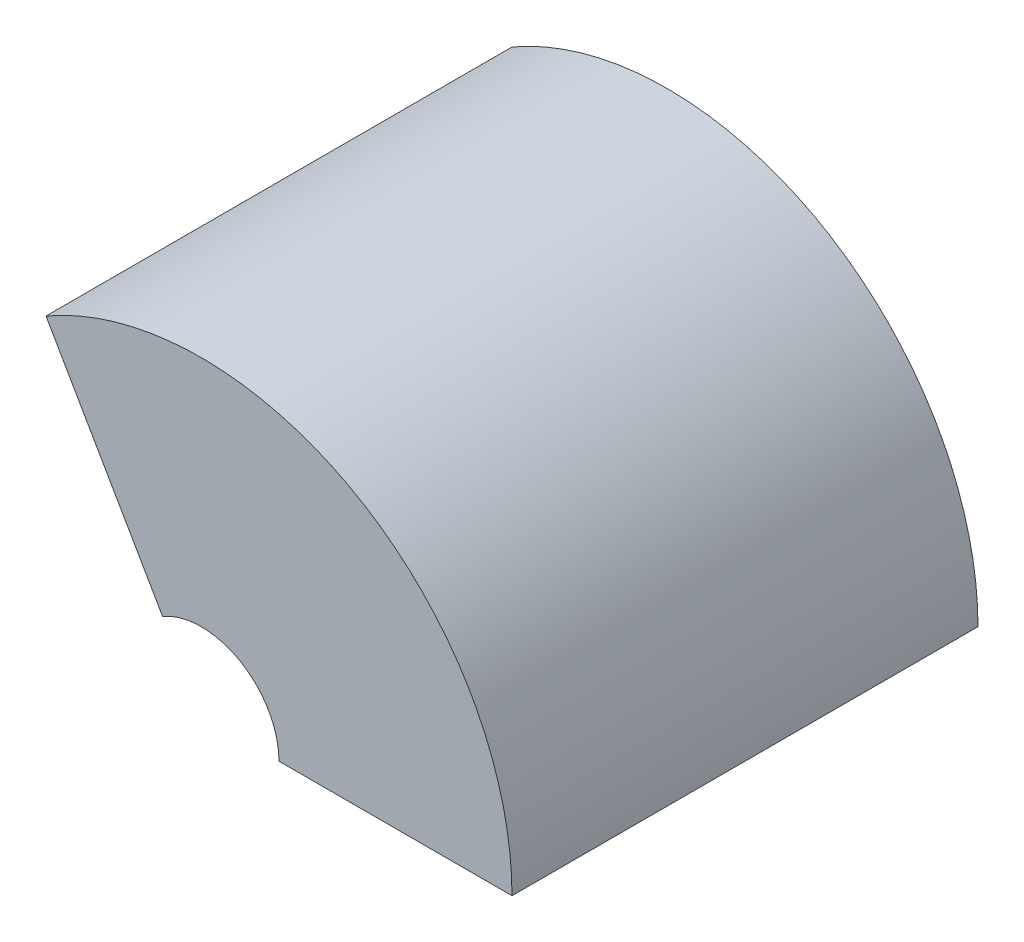
ISO-10303-21;
HEADER;
FILE_DESCRIPTION(('STEP AP214'),'2;1');
FILE_NAME('part.step','',(''),(''),'','','');
FILE_SCHEMA(('AUTOMOTIVE_DESIGN { 1 0 10303 214 1 1 1 1 }'));
ENDSEC;
DATA;
#1=APPLICATION_CONTEXT('core data for automotive mechanical design processes');
#2=APPLICATION_PROTOCOL_DEFINITION('international standard','automotive_design',2000,#1);
#3=PRODUCT_CONTEXT('',#1,'mechanical');
#4=PRODUCT('Part','Part','',(#3));
#5=PRODUCT_RELATED_PRODUCT_CATEGORY('part','',(#4));
#6=PRODUCT_DEFINITION_FORMATION('','',#4);
#7=PRODUCT_DEFINITION_CONTEXT('part definition',#1,'design');
#8=PRODUCT_DEFINITION('design','',#6,#7);
#9=PRODUCT_DEFINITION_SHAPE('','',#8);
#10=(LENGTH_UNIT() NAMED_UNIT(*) SI_UNIT(.MILLI.,.METRE.));
#11=(NAMED_UNIT(*) PLANE_ANGLE_UNIT() SI_UNIT($,.RADIAN.));
#12=(NAMED_UNIT(*) SI_UNIT($,.STERADIAN.) SOLID_ANGLE_UNIT());
#13=UNCERTAINTY_MEASURE_WITH_UNIT(LENGTH_MEASURE(1.E-05),#10,'distance_accuracy_value','');
#14=(GEOMETRIC_REPRESENTATION_CONTEXT(3) GLOBAL_UNCERTAINTY_ASSIGNED_CONTEXT((#13)) GLOBAL_UNIT_ASSIGNED_CONTEXT((#10,
#11,#12)) REPRESENTATION_CONTEXT('',''));
#15=CARTESIAN_POINT('',(0.,0.,0.));
#16=DIRECTION('',(0.,0.,1.));
#17=DIRECTION('',(1.,0.,0.));
#18=AXIS2_PLACEMENT_3D('',#15,#16,#17);
#19=CARTESIAN_POINT('',(0.,0.,0.));
#20=DIRECTION('',(0.,0.,-1.));
#21=DIRECTION('',(-1.,0.,0.));
#22=AXIS2_PLACEMENT_3D('',#19,#20,#21);
#23=CYLINDRICAL_SURFACE('',#22,5.);
#24=CARTESIAN_POINT('',(0.,0.,0.));
#25=DIRECTION('',(0.,0.,-1.));
#26=DIRECTION('',(-1.,0.,0.));
#27=AXIS2_PLACEMENT_3D('',#24,#25,#26);
#28=CIRCLE('',#27,5.);
#29=CARTESIAN_POINT('',(-2.5,4.33012701892219,0.));
#30=VERTEX_POINT('',#29);
#31=CARTESIAN_POINT('',(5.,0.,0.));
#32=VERTEX_POINT('',#31);
#33=EDGE_CURVE('E11',#30,#32,#28,.T.);
#34=ORIENTED_EDGE('',*,*,#33,.F.);
#35=DIRECTION('',(0.,0.,1.));
#36=VECTOR('',#35,1.);
#37=CARTESIAN_POINT('',(-2.5,4.33012701892219,-30.));
#38=LINE('',#37,#36);
#39=CARTESIAN_POINT('',(-2.5,4.33012701892219,-30.));
#40=VERTEX_POINT('',#39);
#41=EDGE_CURVE('E103',#40,#30,#38,.T.);
#42=ORIENTED_EDGE('',*,*,#41,.F.);
#43=CARTESIAN_POINT('',(0.,0.,-30.));
#44=DIRECTION('',(0.,0.,-1.));
#45=DIRECTION('',(-1.,0.,0.));
#46=AXIS2_PLACEMENT_3D('',#43,#44,#45);
#47=CIRCLE('',#46,5.);
#48=CARTESIAN_POINT('',(5.,0.,-30.));
#49=VERTEX_POINT('',#48);
#50=EDGE_CURVE('E56',#40,#49,#47,.T.);
#51=ORIENTED_EDGE('',*,*,#50,.T.);
#52=DIRECTION('',(0.,0.,1.));
#53=VECTOR('',#52,1.);
#54=CARTESIAN_POINT('',(5.,0.,-30.));
#55=LINE('',#54,#53);
#56=EDGE_CURVE('E92',#49,#32,#55,.T.);
#57=ORIENTED_EDGE('',*,*,#56,.T.);
#58=EDGE_LOOP('',(#34,#42,#51,#57));
#59=FACE_BOUND('',#58,.T.);
#60=ADVANCED_FACE('F41',(#59),#23,.F.);
#61=CARTESIAN_POINT('',(-2.5,4.33012701892219,0.));
#62=DIRECTION('',(0.,0.,-1.));
#63=DIRECTION('',(-1.,0.,0.));
#64=AXIS2_PLACEMENT_3D('',#61,#62,#63);
#65=PLANE('',#64);
#66=CARTESIAN_POINT('',(0.,0.,0.));
#67=DIRECTION('',(0.,0.,-1.));
#68=DIRECTION('',(-1.,0.,0.));
#69=AXIS2_PLACEMENT_3D('',#66,#67,#68);
#70=CIRCLE('',#69,20.);
#71=CARTESIAN_POINT('',(-9.99999999999999,17.3205080756888,0.));
#72=VERTEX_POINT('',#71);
#73=CARTESIAN_POINT('',(20.,0.,0.));
#74=VERTEX_POINT('',#73);
#75=EDGE_CURVE('E49',#72,#74,#70,.T.);
#76=ORIENTED_EDGE('',*,*,#75,.F.);
#77=DIRECTION('',(-0.5,0.866025403784439,0.));
#78=VECTOR('',#77,1.);
#79=CARTESIAN_POINT('',(-2.5,4.33012701892219,0.));
#80=LINE('',#79,#78);
#81=EDGE_CURVE('E88',#30,#72,#80,.T.);
#82=ORIENTED_EDGE('',*,*,#81,.F.);
#83=ORIENTED_EDGE('',*,*,#33,.T.);
#84=DIRECTION('',(1.,0.,0.));
#85=VECTOR('',#84,1.);
#86=CARTESIAN_POINT('',(5.,0.,0.));
#87=LINE('',#86,#85);
#88=EDGE_CURVE('E85',#32,#74,#87,.T.);
#89=ORIENTED_EDGE('',*,*,#88,.T.);
#90=EDGE_LOOP('',(#76,#82,#83,#89));
#91=FACE_BOUND('',#90,.T.);
#92=ADVANCED_FACE('F43',(#91),#65,.F.);
#93=CARTESIAN_POINT('',(0.,0.,0.));
#94=DIRECTION('',(0.,0.,-1.));
#95=DIRECTION('',(-1.,0.,0.));
#96=AXIS2_PLACEMENT_3D('',#93,#94,#95);
#97=CYLINDRICAL_SURFACE('',#96,20.);
#98=CARTESIAN_POINT('',(0.,0.,-30.));
#99=DIRECTION('',(0.,0.,-1.));
#100=DIRECTION('',(-1.,0.,0.));
#101=AXIS2_PLACEMENT_3D('',#98,#99,#100);
#102=CIRCLE('',#101,20.);
#103=CARTESIAN_POINT('',(-9.99999999999999,17.3205080756888,-30.));
#104=VERTEX_POINT('',#103);
#105=CARTESIAN_POINT('',(20.,0.,-30.));
#106=VERTEX_POINT('',#105);
#107=EDGE_CURVE('E64',#104,#106,#102,.T.);
#108=ORIENTED_EDGE('',*,*,#107,.F.);
#109=DIRECTION('',(0.,0.,-1.));
#110=VECTOR('',#109,1.);
#111=CARTESIAN_POINT('',(-9.99999999999999,17.3205080756888,0.));
#112=LINE('',#111,#110);
#113=EDGE_CURVE('E106',#72,#104,#112,.T.);
#114=ORIENTED_EDGE('',*,*,#113,.F.);
#115=ORIENTED_EDGE('',*,*,#75,.T.);
#116=DIRECTION('',(0.,0.,-1.));
#117=VECTOR('',#116,1.);
#118=CARTESIAN_POINT('',(20.,0.,0.));
#119=LINE('',#118,#117);
#120=EDGE_CURVE('E97',#74,#106,#119,.T.);
#121=ORIENTED_EDGE('',*,*,#120,.T.);
#122=EDGE_LOOP('',(#108,#114,#115,#121));
#123=FACE_BOUND('',#122,.T.);
#124=ADVANCED_FACE('F112',(#123),#97,.T.);
#125=CARTESIAN_POINT('',(-9.99999999999999,17.3205080756888,-30.));
#126=DIRECTION('',(0.,0.,1.));
#127=DIRECTION('',(1.,0.,0.));
#128=AXIS2_PLACEMENT_3D('',#125,#126,#127);
#129=PLANE('',#128);
#130=DIRECTION('',(0.5,-0.866025403784439,0.));
#131=VECTOR('',#130,1.);
#132=CARTESIAN_POINT('',(-9.99999999999999,17.3205080756888,-30.));
#133=LINE('',#132,#131);
#134=EDGE_CURVE('E108',#104,#40,#133,.T.);
#135=ORIENTED_EDGE('',*,*,#134,.F.);
#136=ORIENTED_EDGE('',*,*,#107,.T.);
#137=DIRECTION('',(-1.,0.,0.));
#138=VECTOR('',#137,1.);
#139=CARTESIAN_POINT('',(20.,0.,-30.));
#140=LINE('',#139,#138);
#141=EDGE_CURVE('E99',#106,#49,#140,.T.);
#142=ORIENTED_EDGE('',*,*,#141,.T.);
#143=ORIENTED_EDGE('',*,*,#50,.F.);
#144=EDGE_LOOP('',(#135,#136,#142,#143));
#145=FACE_BOUND('',#144,.T.);
#146=ADVANCED_FACE('F115',(#145),#129,.F.);
#147=CARTESIAN_POINT('',(0.,0.,0.));
#148=DIRECTION('',(-0.866025403784439,-0.5,0.));
#149=DIRECTION('',(0.,0.,1.));
#150=AXIS2_PLACEMENT_3D('',#147,#148,#149);
#151=PLANE('',#150);
#152=ORIENTED_EDGE('',*,*,#41,.T.);
#153=ORIENTED_EDGE('',*,*,#81,.T.);
#154=ORIENTED_EDGE('',*,*,#113,.T.);
#155=ORIENTED_EDGE('',*,*,#134,.T.);
#156=EDGE_LOOP('',(#152,#153,#154,#155));
#157=FACE_BOUND('',#156,.T.);
#158=ADVANCED_FACE('F114',(#157),#151,.T.);
#159=CARTESIAN_POINT('',(0.,0.,0.));
#160=DIRECTION('',(0.,1.,0.));
#161=DIRECTION('',(0.,0.,1.));
#162=AXIS2_PLACEMENT_3D('',#159,#160,#161);
#163=PLANE('',#162);
#164=ORIENTED_EDGE('',*,*,#56,.F.);
#165=ORIENTED_EDGE('',*,*,#141,.F.);
#166=ORIENTED_EDGE('',*,*,#120,.F.);
#167=ORIENTED_EDGE('',*,*,#88,.F.);
#168=EDGE_LOOP('',(#164,#165,#166,#167));
#169=FACE_BOUND('',#168,.T.);
#170=ADVANCED_FACE('F96',(#169),#163,.F.);
#171=CLOSED_SHELL('',(#60,#92,#124,#146,#158,#170));
#172=MANIFOLD_SOLID_BREP('B2',#171);
#173=ADVANCED_BREP_SHAPE_REPRESENTATION('',(#18,#172),#14);
#174=SHAPE_DEFINITION_REPRESENTATION(#9,#173);
ENDSEC;
END-ISO-10303-21;
